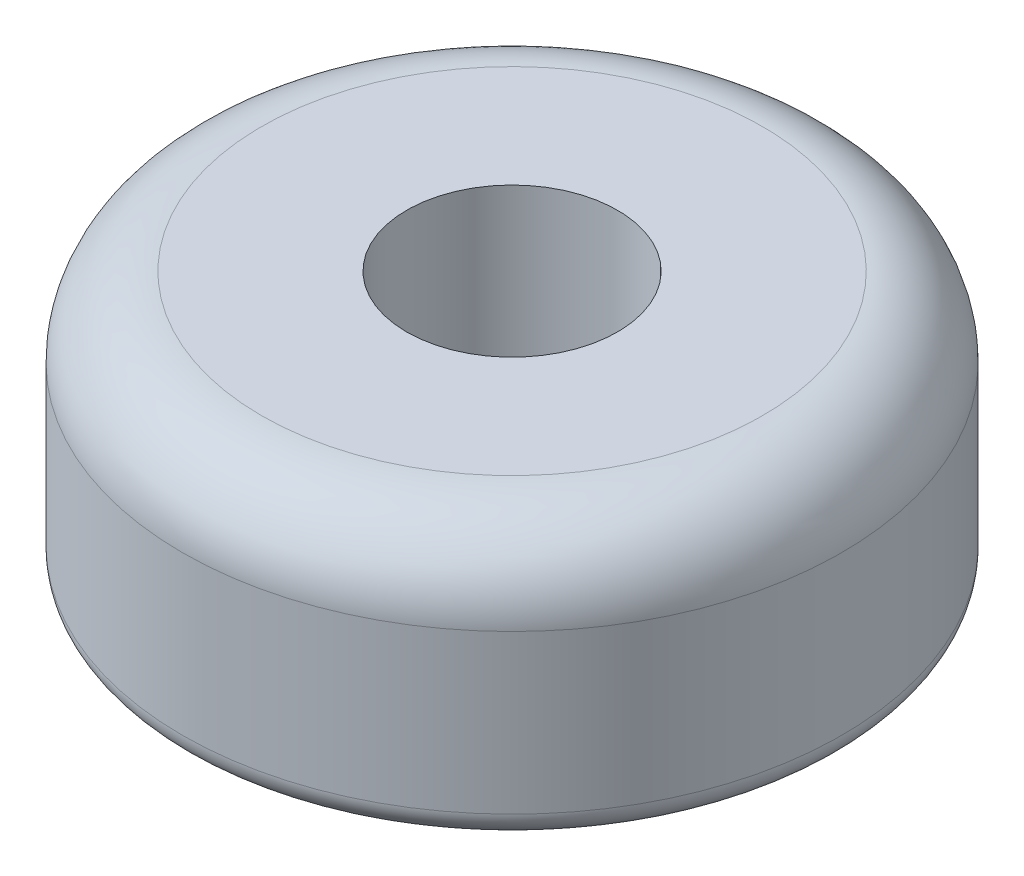
ISO-10303-21;
HEADER;
FILE_DESCRIPTION(('STEP AP214'),'2;1');
FILE_NAME('part.step','',(''),(''),'','','');
FILE_SCHEMA(('AUTOMOTIVE_DESIGN { 1 0 10303 214 1 1 1 1 }'));
ENDSEC;
DATA;
#1=APPLICATION_CONTEXT('core data for automotive mechanical design processes');
#2=APPLICATION_PROTOCOL_DEFINITION('international standard','automotive_design',2000,#1);
#3=PRODUCT_CONTEXT('',#1,'mechanical');
#4=PRODUCT('Part','Part','',(#3));
#5=PRODUCT_RELATED_PRODUCT_CATEGORY('part','',(#4));
#6=PRODUCT_DEFINITION_FORMATION('','',#4);
#7=PRODUCT_DEFINITION_CONTEXT('part definition',#1,'design');
#8=PRODUCT_DEFINITION('design','',#6,#7);
#9=PRODUCT_DEFINITION_SHAPE('','',#8);
#10=(LENGTH_UNIT() NAMED_UNIT(*) SI_UNIT(.MILLI.,.METRE.));
#11=(NAMED_UNIT(*) PLANE_ANGLE_UNIT() SI_UNIT($,.RADIAN.));
#12=(NAMED_UNIT(*) SI_UNIT($,.STERADIAN.) SOLID_ANGLE_UNIT());
#13=UNCERTAINTY_MEASURE_WITH_UNIT(LENGTH_MEASURE(1.E-05),#10,'distance_accuracy_value','');
#14=(GEOMETRIC_REPRESENTATION_CONTEXT(3) GLOBAL_UNCERTAINTY_ASSIGNED_CONTEXT((#13)) GLOBAL_UNIT_ASSIGNED_CONTEXT((#10,
#11,#12)) REPRESENTATION_CONTEXT('',''));
#15=CARTESIAN_POINT('',(0.,0.,0.));
#16=DIRECTION('',(0.,0.,1.));
#17=DIRECTION('',(1.,0.,0.));
#18=AXIS2_PLACEMENT_3D('',#15,#16,#17);
#19=CARTESIAN_POINT('',(0.,10.,0.));
#20=DIRECTION('',(0.,-1.,0.));
#21=DIRECTION('',(0.,0.,-1.));
#22=AXIS2_PLACEMENT_3D('',#19,#20,#21);
#23=CYLINDRICAL_SURFACE('',#22,12.5);
#24=CARTESIAN_POINT('',(0.,0.999999999999999,0.));
#25=DIRECTION('',(0.,1.,0.));
#26=DIRECTION('',(0.,0.,1.));
#27=AXIS2_PLACEMENT_3D('',#24,#25,#26);
#28=CIRCLE('',#27,12.5);
#29=CARTESIAN_POINT('',(0.,0.999999999999999,12.5));
#30=VERTEX_POINT('',#29);
#31=EDGE_CURVE('E44',#30,#30,#28,.T.);
#32=ORIENTED_EDGE('',*,*,#31,.T.);
#33=EDGE_LOOP('',(#32));
#34=FACE_BOUND('',#33,.T.);
#35=CARTESIAN_POINT('',(0.,7.,0.));
#36=DIRECTION('',(0.,1.,0.));
#37=DIRECTION('',(0.,0.,1.));
#38=AXIS2_PLACEMENT_3D('',#35,#36,#37);
#39=CIRCLE('',#38,12.5);
#40=CARTESIAN_POINT('',(0.,7.,12.5));
#41=VERTEX_POINT('',#40);
#42=EDGE_CURVE('E48',#41,#41,#39,.F.);
#43=ORIENTED_EDGE('',*,*,#42,.T.);
#44=EDGE_LOOP('',(#43));
#45=FACE_BOUND('',#44,.T.);
#46=ADVANCED_FACE('F37',(#34,#45),#23,.T.);
#47=CARTESIAN_POINT('',(0.,10.,0.));
#48=DIRECTION('',(0.,1.,0.));
#49=DIRECTION('',(0.,0.,1.));
#50=AXIS2_PLACEMENT_3D('',#47,#48,#49);
#51=PLANE('',#50);
#52=CARTESIAN_POINT('',(0.,10.,0.));
#53=DIRECTION('',(0.,1.,0.));
#54=DIRECTION('',(0.,0.,1.));
#55=AXIS2_PLACEMENT_3D('',#52,#53,#54);
#56=CIRCLE('',#55,4.);
#57=CARTESIAN_POINT('',(0.,10.,4.));
#58=VERTEX_POINT('',#57);
#59=EDGE_CURVE('E58',#58,#58,#56,.T.);
#60=ORIENTED_EDGE('',*,*,#59,.F.);
#61=EDGE_LOOP('',(#60));
#62=FACE_BOUND('',#61,.T.);
#63=CARTESIAN_POINT('',(0.,10.,0.));
#64=DIRECTION('',(0.,1.,0.));
#65=DIRECTION('',(0.,0.,1.));
#66=AXIS2_PLACEMENT_3D('',#63,#64,#65);
#67=CIRCLE('',#66,9.5);
#68=CARTESIAN_POINT('',(0.,10.,9.5));
#69=VERTEX_POINT('',#68);
#70=EDGE_CURVE('E52',#69,#69,#67,.T.);
#71=ORIENTED_EDGE('',*,*,#70,.T.);
#72=EDGE_LOOP('',(#71));
#73=FACE_BOUND('',#72,.T.);
#74=ADVANCED_FACE('F73',(#62,#73),#51,.T.);
#75=CARTESIAN_POINT('',(0.,0.,0.));
#76=DIRECTION('',(0.,1.,0.));
#77=DIRECTION('',(0.,0.,1.));
#78=AXIS2_PLACEMENT_3D('',#75,#76,#77);
#79=PLANE('',#78);
#80=CARTESIAN_POINT('',(0.,0.,0.));
#81=DIRECTION('',(0.,1.,0.));
#82=DIRECTION('',(0.,0.,1.));
#83=AXIS2_PLACEMENT_3D('',#80,#81,#82);
#84=CIRCLE('',#83,11.5);
#85=CARTESIAN_POINT('',(0.,0.,11.5));
#86=VERTEX_POINT('',#85);
#87=EDGE_CURVE('E10',#86,#86,#84,.F.);
#88=ORIENTED_EDGE('',*,*,#87,.T.);
#89=EDGE_LOOP('',(#88));
#90=FACE_BOUND('',#89,.T.);
#91=CARTESIAN_POINT('',(0.,0.,0.));
#92=DIRECTION('',(0.,1.,0.));
#93=DIRECTION('',(0.,0.,1.));
#94=AXIS2_PLACEMENT_3D('',#91,#92,#93);
#95=CIRCLE('',#94,4.);
#96=CARTESIAN_POINT('',(0.,0.,4.));
#97=VERTEX_POINT('',#96);
#98=EDGE_CURVE('E57',#97,#97,#95,.T.);
#99=ORIENTED_EDGE('',*,*,#98,.T.);
#100=EDGE_LOOP('',(#99));
#101=FACE_BOUND('',#100,.T.);
#102=ADVANCED_FACE('F64',(#90,#101),#79,.F.);
#103=CARTESIAN_POINT('',(0.,7.,0.));
#104=DIRECTION('',(0.,1.,0.));
#105=DIRECTION('',(0.,0.,1.));
#106=AXIS2_PLACEMENT_3D('',#103,#104,#105);
#107=TOROIDAL_SURFACE('',#106,9.5,3.);
#108=ORIENTED_EDGE('',*,*,#42,.F.);
#109=EDGE_LOOP('',(#108));
#110=FACE_BOUND('',#109,.T.);
#111=ORIENTED_EDGE('',*,*,#70,.F.);
#112=EDGE_LOOP('',(#111));
#113=FACE_BOUND('',#112,.T.);
#114=ADVANCED_FACE('F69',(#110,#113),#107,.T.);
#115=CARTESIAN_POINT('',(0.,0.,0.));
#116=DIRECTION('',(0.,1.,0.));
#117=DIRECTION('',(0.,0.,1.));
#118=AXIS2_PLACEMENT_3D('',#115,#116,#117);
#119=CYLINDRICAL_SURFACE('',#118,4.);
#120=ORIENTED_EDGE('',*,*,#98,.F.);
#121=EDGE_LOOP('',(#120));
#122=FACE_BOUND('',#121,.T.);
#123=ORIENTED_EDGE('',*,*,#59,.T.);
#124=EDGE_LOOP('',(#123));
#125=FACE_BOUND('',#124,.T.);
#126=ADVANCED_FACE('F66',(#122,#125),#119,.F.);
#127=CARTESIAN_POINT('',(0.,0.999999999999999,0.));
#128=DIRECTION('',(0.,1.,0.));
#129=DIRECTION('',(0.,0.,1.));
#130=AXIS2_PLACEMENT_3D('',#127,#128,#129);
#131=TOROIDAL_SURFACE('',#130,11.5,1.);
#132=ORIENTED_EDGE('',*,*,#87,.F.);
#133=EDGE_LOOP('',(#132));
#134=FACE_BOUND('',#133,.T.);
#135=ORIENTED_EDGE('',*,*,#31,.F.);
#136=EDGE_LOOP('',(#135));
#137=FACE_BOUND('',#136,.T.);
#138=ADVANCED_FACE('F39',(#134,#137),#131,.T.);
#139=CLOSED_SHELL('',(#46,#74,#102,#114,#126,#138));
#140=MANIFOLD_SOLID_BREP('B2',#139);
#141=ADVANCED_BREP_SHAPE_REPRESENTATION('',(#18,#140),#14);
#142=SHAPE_DEFINITION_REPRESENTATION(#9,#141);
ENDSEC;
END-ISO-10303-21;
